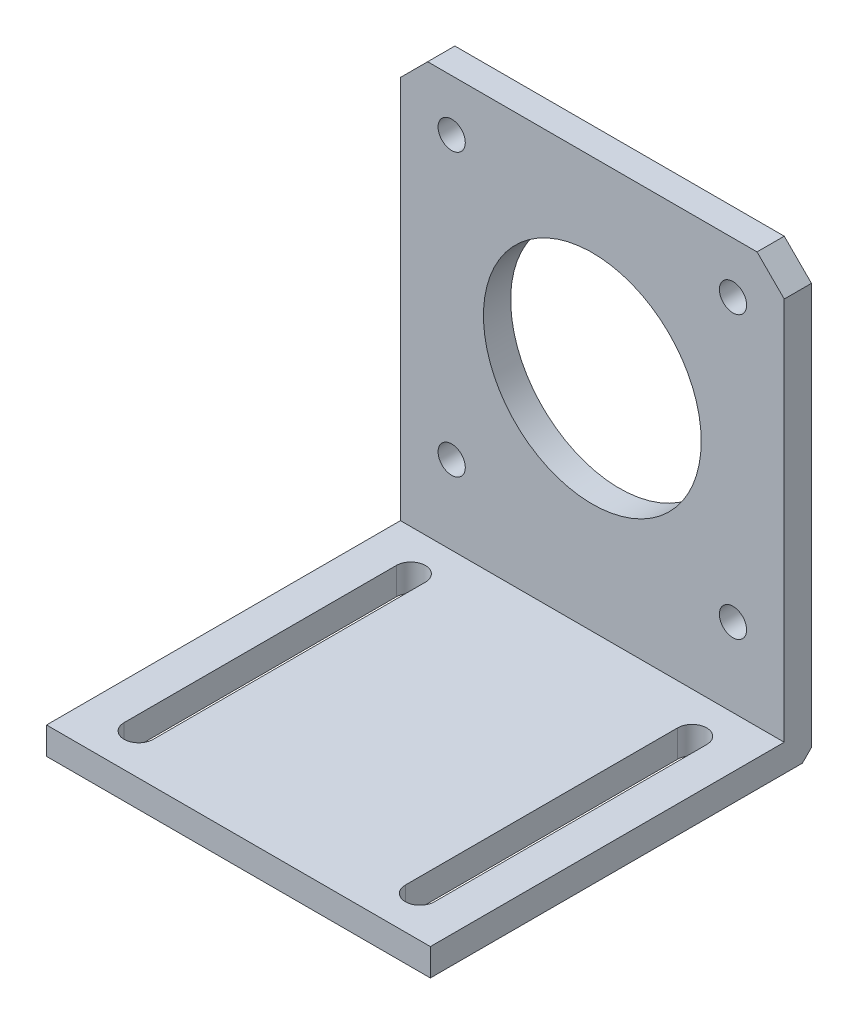
ISO-10303-21;
HEADER;
FILE_DESCRIPTION(('STEP AP214'),'2;1');
FILE_NAME('part.step','',(''),(''),'','','');
FILE_SCHEMA(('AUTOMOTIVE_DESIGN { 1 0 10303 214 1 1 1 1 }'));
ENDSEC;
DATA;
#1=APPLICATION_CONTEXT('core data for automotive mechanical design processes');
#2=APPLICATION_PROTOCOL_DEFINITION('international standard','automotive_design',2000,#1);
#3=PRODUCT_CONTEXT('',#1,'mechanical');
#4=PRODUCT('Part','Part','',(#3));
#5=PRODUCT_RELATED_PRODUCT_CATEGORY('part','',(#4));
#6=PRODUCT_DEFINITION_FORMATION('','',#4);
#7=PRODUCT_DEFINITION_CONTEXT('part definition',#1,'design');
#8=PRODUCT_DEFINITION('design','',#6,#7);
#9=PRODUCT_DEFINITION_SHAPE('','',#8);
#10=(LENGTH_UNIT() NAMED_UNIT(*) SI_UNIT(.MILLI.,.METRE.));
#11=(NAMED_UNIT(*) PLANE_ANGLE_UNIT() SI_UNIT($,.RADIAN.));
#12=(NAMED_UNIT(*) SI_UNIT($,.STERADIAN.) SOLID_ANGLE_UNIT());
#13=UNCERTAINTY_MEASURE_WITH_UNIT(LENGTH_MEASURE(1.E-05),#10,'distance_accuracy_value','');
#14=(GEOMETRIC_REPRESENTATION_CONTEXT(3) GLOBAL_UNCERTAINTY_ASSIGNED_CONTEXT((#13)) GLOBAL_UNIT_ASSIGNED_CONTEXT((#10,
#11,#12)) REPRESENTATION_CONTEXT('',''));
#15=CARTESIAN_POINT('',(0.,0.,0.));
#16=DIRECTION('',(0.,0.,1.));
#17=DIRECTION('',(1.,0.,0.));
#18=AXIS2_PLACEMENT_3D('',#15,#16,#17);
#19=CARTESIAN_POINT('',(0.,0.,3.));
#20=DIRECTION('',(0.,0.,-1.));
#21=DIRECTION('',(-1.,0.,0.));
#22=AXIS2_PLACEMENT_3D('',#19,#20,#21);
#23=PLANE('',#22);
#24=CARTESIAN_POINT('',(-15.4999999999991,-15.5,3.));
#25=DIRECTION('',(0.,0.,1.));
#26=DIRECTION('',(1.,0.,0.));
#27=AXIS2_PLACEMENT_3D('',#24,#25,#26);
#28=CIRCLE('',#27,1.50000000000046);
#29=CARTESIAN_POINT('',(-13.9999999999987,-15.5,3.));
#30=VERTEX_POINT('',#29);
#31=EDGE_CURVE('E247',#30,#30,#28,.T.);
#32=ORIENTED_EDGE('',*,*,#31,.F.);
#33=EDGE_LOOP('',(#32));
#34=FACE_BOUND('',#33,.T.);
#35=CARTESIAN_POINT('',(15.5000000000009,-15.4999999999991,3.));
#36=DIRECTION('',(0.,0.,1.));
#37=DIRECTION('',(1.,0.,0.));
#38=AXIS2_PLACEMENT_3D('',#35,#36,#37);
#39=CIRCLE('',#38,1.50000000000121);
#40=CARTESIAN_POINT('',(17.0000000000021,-15.4999999999991,3.));
#41=VERTEX_POINT('',#40);
#42=EDGE_CURVE('E253',#41,#41,#39,.T.);
#43=ORIENTED_EDGE('',*,*,#42,.F.);
#44=EDGE_LOOP('',(#43));
#45=FACE_BOUND('',#44,.T.);
#46=CARTESIAN_POINT('',(15.5,15.5000000000009,3.));
#47=DIRECTION('',(0.,0.,1.));
#48=DIRECTION('',(1.,0.,0.));
#49=AXIS2_PLACEMENT_3D('',#46,#47,#48);
#50=CIRCLE('',#49,1.50000000000089);
#51=CARTESIAN_POINT('',(17.0000000000009,15.5000000000009,3.));
#52=VERTEX_POINT('',#51);
#53=EDGE_CURVE('E259',#52,#52,#50,.T.);
#54=ORIENTED_EDGE('',*,*,#53,.F.);
#55=EDGE_LOOP('',(#54));
#56=FACE_BOUND('',#55,.T.);
#57=CARTESIAN_POINT('',(0.,0.,3.));
#58=DIRECTION('',(0.,0.,1.));
#59=DIRECTION('',(1.,0.,0.));
#60=AXIS2_PLACEMENT_3D('',#57,#58,#59);
#61=CIRCLE('',#60,12.);
#62=CARTESIAN_POINT('',(12.,0.,3.));
#63=VERTEX_POINT('',#62);
#64=EDGE_CURVE('E265',#63,#63,#61,.T.);
#65=ORIENTED_EDGE('',*,*,#64,.F.);
#66=EDGE_LOOP('',(#65));
#67=FACE_BOUND('',#66,.T.);
#68=CARTESIAN_POINT('',(-15.5,15.5,3.));
#69=DIRECTION('',(0.,0.,1.));
#70=DIRECTION('',(1.,0.,0.));
#71=AXIS2_PLACEMENT_3D('',#68,#69,#70);
#72=CIRCLE('',#71,1.5);
#73=CARTESIAN_POINT('',(-14.,15.5,3.));
#74=VERTEX_POINT('',#73);
#75=EDGE_CURVE('E271',#74,#74,#72,.T.);
#76=ORIENTED_EDGE('',*,*,#75,.F.);
#77=EDGE_LOOP('',(#76));
#78=FACE_BOUND('',#77,.T.);
#79=DIRECTION('',(-1.,0.,0.));
#80=VECTOR('',#79,1.);
#81=CARTESIAN_POINT('',(-21.15,-24.15,3.));
#82=LINE('',#81,#80);
#83=CARTESIAN_POINT('',(21.15,-24.15,3.));
#84=VERTEX_POINT('',#83);
#85=CARTESIAN_POINT('',(-21.15,-24.15,3.));
#86=VERTEX_POINT('',#85);
#87=EDGE_CURVE('E189',#84,#86,#82,.T.);
#88=ORIENTED_EDGE('',*,*,#87,.F.);
#89=DIRECTION('',(0.,1.,0.));
#90=VECTOR('',#89,1.);
#91=CARTESIAN_POINT('',(21.15,18.15,3.));
#92=LINE('',#91,#90);
#93=CARTESIAN_POINT('',(21.15,18.15,3.));
#94=VERTEX_POINT('',#93);
#95=EDGE_CURVE('E285',#84,#94,#92,.T.);
#96=ORIENTED_EDGE('',*,*,#95,.T.);
#97=DIRECTION('',(-0.707106781186548,0.707106781186548,0.));
#98=VECTOR('',#97,1.);
#99=CARTESIAN_POINT('',(18.15,21.15,3.));
#100=LINE('',#99,#98);
#101=CARTESIAN_POINT('',(18.15,21.15,3.));
#102=VERTEX_POINT('',#101);
#103=EDGE_CURVE('E287',#94,#102,#100,.T.);
#104=ORIENTED_EDGE('',*,*,#103,.T.);
#105=DIRECTION('',(-1.,0.,0.));
#106=VECTOR('',#105,1.);
#107=CARTESIAN_POINT('',(-18.15,21.15,3.));
#108=LINE('',#107,#106);
#109=CARTESIAN_POINT('',(-18.15,21.15,3.));
#110=VERTEX_POINT('',#109);
#111=EDGE_CURVE('E277',#102,#110,#108,.T.);
#112=ORIENTED_EDGE('',*,*,#111,.T.);
#113=DIRECTION('',(-0.707106781186548,-0.707106781186548,0.));
#114=VECTOR('',#113,1.);
#115=CARTESIAN_POINT('',(-21.15,18.15,3.));
#116=LINE('',#115,#114);
#117=CARTESIAN_POINT('',(-21.15,18.15,3.));
#118=VERTEX_POINT('',#117);
#119=EDGE_CURVE('E280',#110,#118,#116,.T.);
#120=ORIENTED_EDGE('',*,*,#119,.T.);
#121=DIRECTION('',(0.,-1.,0.));
#122=VECTOR('',#121,1.);
#123=CARTESIAN_POINT('',(-21.15,18.15,3.));
#124=LINE('',#123,#122);
#125=EDGE_CURVE('E283',#118,#86,#124,.T.);
#126=ORIENTED_EDGE('',*,*,#125,.T.);
#127=EDGE_LOOP('',(#88,#96,#104,#112,#120,#126));
#128=FACE_BOUND('',#127,.T.);
#129=ADVANCED_FACE('F33',(#34,#45,#56,#67,#78,#128),#23,.F.);
#130=CARTESIAN_POINT('',(0.,0.,0.));
#131=DIRECTION('',(0.,0.,-1.));
#132=DIRECTION('',(-1.,0.,0.));
#133=AXIS2_PLACEMENT_3D('',#130,#131,#132);
#134=PLANE('',#133);
#135=CARTESIAN_POINT('',(15.5000000000009,-15.4999999999991,0.));
#136=DIRECTION('',(0.,0.,1.));
#137=DIRECTION('',(1.,0.,0.));
#138=AXIS2_PLACEMENT_3D('',#135,#136,#137);
#139=CIRCLE('',#138,1.50000000000121);
#140=CARTESIAN_POINT('',(17.0000000000021,-15.4999999999991,0.));
#141=VERTEX_POINT('',#140);
#142=EDGE_CURVE('E250',#141,#141,#139,.T.);
#143=ORIENTED_EDGE('',*,*,#142,.T.);
#144=EDGE_LOOP('',(#143));
#145=FACE_BOUND('',#144,.T.);
#146=CARTESIAN_POINT('',(0.,0.,0.));
#147=DIRECTION('',(0.,0.,1.));
#148=DIRECTION('',(1.,0.,0.));
#149=AXIS2_PLACEMENT_3D('',#146,#147,#148);
#150=CIRCLE('',#149,12.);
#151=CARTESIAN_POINT('',(12.,0.,0.));
#152=VERTEX_POINT('',#151);
#153=EDGE_CURVE('E262',#152,#152,#150,.T.);
#154=ORIENTED_EDGE('',*,*,#153,.T.);
#155=EDGE_LOOP('',(#154));
#156=FACE_BOUND('',#155,.T.);
#157=DIRECTION('',(0.,1.,0.));
#158=VECTOR('',#157,1.);
#159=CARTESIAN_POINT('',(21.15,18.15,0.));
#160=LINE('',#159,#158);
#161=CARTESIAN_POINT('',(21.15,-26.15,0.));
#162=VERTEX_POINT('',#161);
#163=CARTESIAN_POINT('',(21.15,18.15,0.));
#164=VERTEX_POINT('',#163);
#165=EDGE_CURVE('E297',#162,#164,#160,.T.);
#166=ORIENTED_EDGE('',*,*,#165,.F.);
#167=DIRECTION('',(-1.,0.,0.));
#168=VECTOR('',#167,1.);
#169=CARTESIAN_POINT('',(0.,-26.15,0.));
#170=LINE('',#169,#168);
#171=CARTESIAN_POINT('',(-21.15,-26.15,0.));
#172=VERTEX_POINT('',#171);
#173=EDGE_CURVE('E311',#162,#172,#170,.T.);
#174=ORIENTED_EDGE('',*,*,#173,.T.);
#175=DIRECTION('',(0.,-1.,0.));
#176=VECTOR('',#175,1.);
#177=CARTESIAN_POINT('',(-21.15,18.15,0.));
#178=LINE('',#177,#176);
#179=CARTESIAN_POINT('',(-21.15,18.15,0.));
#180=VERTEX_POINT('',#179);
#181=EDGE_CURVE('E294',#180,#172,#178,.T.);
#182=ORIENTED_EDGE('',*,*,#181,.F.);
#183=DIRECTION('',(-0.707106781186548,-0.707106781186548,0.));
#184=VECTOR('',#183,1.);
#185=CARTESIAN_POINT('',(-21.15,18.15,0.));
#186=LINE('',#185,#184);
#187=CARTESIAN_POINT('',(-18.15,21.15,0.));
#188=VERTEX_POINT('',#187);
#189=EDGE_CURVE('E292',#188,#180,#186,.T.);
#190=ORIENTED_EDGE('',*,*,#189,.F.);
#191=DIRECTION('',(-1.,0.,0.));
#192=VECTOR('',#191,1.);
#193=CARTESIAN_POINT('',(-18.15,21.15,0.));
#194=LINE('',#193,#192);
#195=CARTESIAN_POINT('',(18.15,21.15,0.));
#196=VERTEX_POINT('',#195);
#197=EDGE_CURVE('E274',#196,#188,#194,.T.);
#198=ORIENTED_EDGE('',*,*,#197,.F.);
#199=DIRECTION('',(-0.707106781186548,0.707106781186548,0.));
#200=VECTOR('',#199,1.);
#201=CARTESIAN_POINT('',(18.15,21.15,0.));
#202=LINE('',#201,#200);
#203=EDGE_CURVE('E281',#164,#196,#202,.T.);
#204=ORIENTED_EDGE('',*,*,#203,.F.);
#205=EDGE_LOOP('',(#166,#174,#182,#190,#198,#204));
#206=FACE_BOUND('',#205,.T.);
#207=CARTESIAN_POINT('',(-15.5,15.5,0.));
#208=DIRECTION('',(0.,0.,1.));
#209=DIRECTION('',(1.,0.,0.));
#210=AXIS2_PLACEMENT_3D('',#207,#208,#209);
#211=CIRCLE('',#210,1.5);
#212=CARTESIAN_POINT('',(-14.,15.5,0.));
#213=VERTEX_POINT('',#212);
#214=EDGE_CURVE('E268',#213,#213,#211,.T.);
#215=ORIENTED_EDGE('',*,*,#214,.T.);
#216=EDGE_LOOP('',(#215));
#217=FACE_BOUND('',#216,.T.);
#218=CARTESIAN_POINT('',(15.5,15.5000000000009,0.));
#219=DIRECTION('',(0.,0.,1.));
#220=DIRECTION('',(1.,0.,0.));
#221=AXIS2_PLACEMENT_3D('',#218,#219,#220);
#222=CIRCLE('',#221,1.50000000000089);
#223=CARTESIAN_POINT('',(17.0000000000009,15.5000000000009,0.));
#224=VERTEX_POINT('',#223);
#225=EDGE_CURVE('E256',#224,#224,#222,.T.);
#226=ORIENTED_EDGE('',*,*,#225,.T.);
#227=EDGE_LOOP('',(#226));
#228=FACE_BOUND('',#227,.T.);
#229=CARTESIAN_POINT('',(-15.4999999999991,-15.5,0.));
#230=DIRECTION('',(0.,0.,1.));
#231=DIRECTION('',(1.,0.,0.));
#232=AXIS2_PLACEMENT_3D('',#229,#230,#231);
#233=CIRCLE('',#232,1.50000000000046);
#234=CARTESIAN_POINT('',(-13.9999999999987,-15.5,0.));
#235=VERTEX_POINT('',#234);
#236=EDGE_CURVE('E244',#235,#235,#233,.T.);
#237=ORIENTED_EDGE('',*,*,#236,.T.);
#238=EDGE_LOOP('',(#237));
#239=FACE_BOUND('',#238,.T.);
#240=ADVANCED_FACE('F328',(#145,#156,#206,#217,#228,#239),#134,.T.);
#241=CARTESIAN_POINT('',(-18.15,21.15,3.));
#242=DIRECTION('',(0.,-1.,0.));
#243=DIRECTION('',(0.,0.,-1.));
#244=AXIS2_PLACEMENT_3D('',#241,#242,#243);
#245=PLANE('',#244);
#246=ORIENTED_EDGE('',*,*,#197,.T.);
#247=DIRECTION('',(0.,0.,-1.));
#248=VECTOR('',#247,1.);
#249=CARTESIAN_POINT('',(-18.15,21.15,3.));
#250=LINE('',#249,#248);
#251=EDGE_CURVE('E308',#110,#188,#250,.T.);
#252=ORIENTED_EDGE('',*,*,#251,.F.);
#253=ORIENTED_EDGE('',*,*,#111,.F.);
#254=DIRECTION('',(0.,0.,-1.));
#255=VECTOR('',#254,1.);
#256=CARTESIAN_POINT('',(18.15,21.15,3.));
#257=LINE('',#256,#255);
#258=EDGE_CURVE('E289',#102,#196,#257,.T.);
#259=ORIENTED_EDGE('',*,*,#258,.T.);
#260=EDGE_LOOP('',(#246,#252,#253,#259));
#261=FACE_BOUND('',#260,.T.);
#262=ADVANCED_FACE('F340',(#261),#245,.F.);
#263=CARTESIAN_POINT('',(-21.15,18.15,3.));
#264=DIRECTION('',(0.707106781186547,-0.707106781186547,0.));
#265=DIRECTION('',(0.707106781186548,0.707106781186548,0.));
#266=AXIS2_PLACEMENT_3D('',#263,#264,#265);
#267=PLANE('',#266);
#268=ORIENTED_EDGE('',*,*,#189,.T.);
#269=DIRECTION('',(0.,0.,-1.));
#270=VECTOR('',#269,1.);
#271=CARTESIAN_POINT('',(-21.15,18.15,3.));
#272=LINE('',#271,#270);
#273=EDGE_CURVE('E305',#118,#180,#272,.T.);
#274=ORIENTED_EDGE('',*,*,#273,.F.);
#275=ORIENTED_EDGE('',*,*,#119,.F.);
#276=ORIENTED_EDGE('',*,*,#251,.T.);
#277=EDGE_LOOP('',(#268,#274,#275,#276));
#278=FACE_BOUND('',#277,.T.);
#279=ADVANCED_FACE('F336',(#278),#267,.F.);
#280=CARTESIAN_POINT('',(-21.15,18.15,3.));
#281=DIRECTION('',(1.,0.,0.));
#282=DIRECTION('',(0.,1.,0.));
#283=AXIS2_PLACEMENT_3D('',#280,#281,#282);
#284=PLANE('',#283);
#285=ORIENTED_EDGE('',*,*,#181,.T.);
#286=DIRECTION('',(0.,0.707106781186545,-0.70710678118655));
#287=VECTOR('',#286,1.);
#288=CARTESIAN_POINT('',(-21.15,-26.15,0.));
#289=LINE('',#288,#287);
#290=CARTESIAN_POINT('',(-21.15,-27.15,1.));
#291=VERTEX_POINT('',#290);
#292=EDGE_CURVE('E314',#172,#291,#289,.F.);
#293=ORIENTED_EDGE('',*,*,#292,.T.);
#294=DIRECTION('',(0.,0.,-1.));
#295=VECTOR('',#294,1.);
#296=CARTESIAN_POINT('',(-21.15,-27.15,3.));
#297=LINE('',#296,#295);
#298=CARTESIAN_POINT('',(-21.15,-27.15,42.));
#299=VERTEX_POINT('',#298);
#300=EDGE_CURVE('E241',#299,#291,#297,.T.);
#301=ORIENTED_EDGE('',*,*,#300,.F.);
#302=DIRECTION('',(0.,-1.,0.));
#303=VECTOR('',#302,1.);
#304=CARTESIAN_POINT('',(-21.15,-27.15,42.));
#305=LINE('',#304,#303);
#306=CARTESIAN_POINT('',(-21.15,-24.15,42.));
#307=VERTEX_POINT('',#306);
#308=EDGE_CURVE('E222',#307,#299,#305,.T.);
#309=ORIENTED_EDGE('',*,*,#308,.F.);
#310=DIRECTION('',(0.,0.,-1.));
#311=VECTOR('',#310,1.);
#312=CARTESIAN_POINT('',(-21.15,-24.15,42.));
#313=LINE('',#312,#311);
#314=EDGE_CURVE('E232',#307,#86,#313,.T.);
#315=ORIENTED_EDGE('',*,*,#314,.T.);
#316=ORIENTED_EDGE('',*,*,#125,.F.);
#317=ORIENTED_EDGE('',*,*,#273,.T.);
#318=EDGE_LOOP('',(#285,#293,#301,#309,#315,#316,#317));
#319=FACE_BOUND('',#318,.T.);
#320=ADVANCED_FACE('F332',(#319),#284,.F.);
#321=CARTESIAN_POINT('',(21.15,18.15,3.));
#322=DIRECTION('',(-1.,0.,0.));
#323=DIRECTION('',(0.,-1.,0.));
#324=AXIS2_PLACEMENT_3D('',#321,#322,#323);
#325=PLANE('',#324);
#326=DIRECTION('',(0.,0.,-1.));
#327=VECTOR('',#326,1.);
#328=CARTESIAN_POINT('',(21.15,-27.15,3.));
#329=LINE('',#328,#327);
#330=CARTESIAN_POINT('',(21.15,-27.15,42.));
#331=VERTEX_POINT('',#330);
#332=CARTESIAN_POINT('',(21.15,-27.15,1.));
#333=VERTEX_POINT('',#332);
#334=EDGE_CURVE('E240',#331,#333,#329,.T.);
#335=ORIENTED_EDGE('',*,*,#334,.T.);
#336=DIRECTION('',(0.,-0.707106781186545,0.70710678118655));
#337=VECTOR('',#336,1.);
#338=CARTESIAN_POINT('',(21.15,-26.15,0.));
#339=LINE('',#338,#337);
#340=EDGE_CURVE('E11',#333,#162,#339,.F.);
#341=ORIENTED_EDGE('',*,*,#340,.T.);
#342=ORIENTED_EDGE('',*,*,#165,.T.);
#343=DIRECTION('',(0.,0.,-1.));
#344=VECTOR('',#343,1.);
#345=CARTESIAN_POINT('',(21.15,18.15,3.));
#346=LINE('',#345,#344);
#347=EDGE_CURVE('E302',#94,#164,#346,.T.);
#348=ORIENTED_EDGE('',*,*,#347,.F.);
#349=ORIENTED_EDGE('',*,*,#95,.F.);
#350=DIRECTION('',(0.,0.,-1.));
#351=VECTOR('',#350,1.);
#352=CARTESIAN_POINT('',(21.15,-24.15,42.));
#353=LINE('',#352,#351);
#354=CARTESIAN_POINT('',(21.15,-24.15,42.));
#355=VERTEX_POINT('',#354);
#356=EDGE_CURVE('E237',#355,#84,#353,.T.);
#357=ORIENTED_EDGE('',*,*,#356,.F.);
#358=DIRECTION('',(0.,1.,0.));
#359=VECTOR('',#358,1.);
#360=CARTESIAN_POINT('',(21.15,-27.15,42.));
#361=LINE('',#360,#359);
#362=EDGE_CURVE('E228',#331,#355,#361,.T.);
#363=ORIENTED_EDGE('',*,*,#362,.F.);
#364=EDGE_LOOP('',(#335,#341,#342,#348,#349,#357,#363));
#365=FACE_BOUND('',#364,.T.);
#366=ADVANCED_FACE('F322',(#365),#325,.F.);
#367=CARTESIAN_POINT('',(18.15,21.15,3.));
#368=DIRECTION('',(-0.707106781186547,-0.707106781186547,0.));
#369=DIRECTION('',(0.707106781186548,-0.707106781186548,0.));
#370=AXIS2_PLACEMENT_3D('',#367,#368,#369);
#371=PLANE('',#370);
#372=ORIENTED_EDGE('',*,*,#203,.T.);
#373=ORIENTED_EDGE('',*,*,#258,.F.);
#374=ORIENTED_EDGE('',*,*,#103,.F.);
#375=ORIENTED_EDGE('',*,*,#347,.T.);
#376=EDGE_LOOP('',(#372,#373,#374,#375));
#377=FACE_BOUND('',#376,.T.);
#378=ADVANCED_FACE('F345',(#377),#371,.F.);
#379=CARTESIAN_POINT('',(-15.5,15.5,3.));
#380=DIRECTION('',(0.,0.,-1.));
#381=DIRECTION('',(-1.,0.,0.));
#382=AXIS2_PLACEMENT_3D('',#379,#380,#381);
#383=CYLINDRICAL_SURFACE('',#382,1.5);
#384=ORIENTED_EDGE('',*,*,#75,.T.);
#385=EDGE_LOOP('',(#384));
#386=FACE_BOUND('',#385,.T.);
#387=ORIENTED_EDGE('',*,*,#214,.F.);
#388=EDGE_LOOP('',(#387));
#389=FACE_BOUND('',#388,.T.);
#390=ADVANCED_FACE('F377',(#386,#389),#383,.F.);
#391=CARTESIAN_POINT('',(0.,0.,3.));
#392=DIRECTION('',(0.,0.,-1.));
#393=DIRECTION('',(-1.,0.,0.));
#394=AXIS2_PLACEMENT_3D('',#391,#392,#393);
#395=CYLINDRICAL_SURFACE('',#394,12.);
#396=ORIENTED_EDGE('',*,*,#64,.T.);
#397=EDGE_LOOP('',(#396));
#398=FACE_BOUND('',#397,.T.);
#399=ORIENTED_EDGE('',*,*,#153,.F.);
#400=EDGE_LOOP('',(#399));
#401=FACE_BOUND('',#400,.T.);
#402=ADVANCED_FACE('F415',(#398,#401),#395,.F.);
#403=CARTESIAN_POINT('',(15.5,15.5000000000009,3.));
#404=DIRECTION('',(0.,0.,-1.));
#405=DIRECTION('',(-1.,0.,0.));
#406=AXIS2_PLACEMENT_3D('',#403,#404,#405);
#407=CYLINDRICAL_SURFACE('',#406,1.50000000000089);
#408=ORIENTED_EDGE('',*,*,#53,.T.);
#409=EDGE_LOOP('',(#408));
#410=FACE_BOUND('',#409,.T.);
#411=ORIENTED_EDGE('',*,*,#225,.F.);
#412=EDGE_LOOP('',(#411));
#413=FACE_BOUND('',#412,.T.);
#414=ADVANCED_FACE('F422',(#410,#413),#407,.F.);
#415=CARTESIAN_POINT('',(15.5000000000009,-15.4999999999991,3.));
#416=DIRECTION('',(0.,0.,-1.));
#417=DIRECTION('',(-1.,0.,0.));
#418=AXIS2_PLACEMENT_3D('',#415,#416,#417);
#419=CYLINDRICAL_SURFACE('',#418,1.50000000000121);
#420=ORIENTED_EDGE('',*,*,#42,.T.);
#421=EDGE_LOOP('',(#420));
#422=FACE_BOUND('',#421,.T.);
#423=ORIENTED_EDGE('',*,*,#142,.F.);
#424=EDGE_LOOP('',(#423));
#425=FACE_BOUND('',#424,.T.);
#426=ADVANCED_FACE('F429',(#422,#425),#419,.F.);
#427=CARTESIAN_POINT('',(-15.4999999999991,-15.5,3.));
#428=DIRECTION('',(0.,0.,-1.));
#429=DIRECTION('',(-1.,0.,0.));
#430=AXIS2_PLACEMENT_3D('',#427,#428,#429);
#431=CYLINDRICAL_SURFACE('',#430,1.50000000000046);
#432=ORIENTED_EDGE('',*,*,#31,.T.);
#433=EDGE_LOOP('',(#432));
#434=FACE_BOUND('',#433,.T.);
#435=ORIENTED_EDGE('',*,*,#236,.F.);
#436=EDGE_LOOP('',(#435));
#437=FACE_BOUND('',#436,.T.);
#438=ADVANCED_FACE('F437',(#434,#437),#431,.F.);
#439=CARTESIAN_POINT('',(21.15,-27.15,3.));
#440=DIRECTION('',(0.,-1.,0.));
#441=DIRECTION('',(0.,0.,-1.));
#442=AXIS2_PLACEMENT_3D('',#439,#440,#441);
#443=PLANE('',#442);
#444=CARTESIAN_POINT('',(15.5,-27.15,7.5));
#445=DIRECTION('',(0.,1.,0.));
#446=DIRECTION('',(0.,0.,1.));
#447=AXIS2_PLACEMENT_3D('',#444,#445,#446);
#448=CIRCLE('',#447,1.6);
#449=CARTESIAN_POINT('',(17.1,-27.15,7.5));
#450=VERTEX_POINT('',#449);
#451=CARTESIAN_POINT('',(13.9,-27.15,7.5));
#452=VERTEX_POINT('',#451);
#453=EDGE_CURVE('E155',#450,#452,#448,.T.);
#454=ORIENTED_EDGE('',*,*,#453,.T.);
#455=DIRECTION('',(0.,0.,1.));
#456=VECTOR('',#455,1.);
#457=CARTESIAN_POINT('',(13.9,-27.15,7.5));
#458=LINE('',#457,#456);
#459=CARTESIAN_POINT('',(13.9,-27.15,37.5));
#460=VERTEX_POINT('',#459);
#461=EDGE_CURVE('E166',#452,#460,#458,.T.);
#462=ORIENTED_EDGE('',*,*,#461,.T.);
#463=CARTESIAN_POINT('',(15.5,-27.15,37.5));
#464=DIRECTION('',(0.,1.,0.));
#465=DIRECTION('',(0.,0.,1.));
#466=AXIS2_PLACEMENT_3D('',#463,#464,#465);
#467=CIRCLE('',#466,1.6);
#468=CARTESIAN_POINT('',(17.1,-27.15,37.5));
#469=VERTEX_POINT('',#468);
#470=EDGE_CURVE('E48',#460,#469,#467,.T.);
#471=ORIENTED_EDGE('',*,*,#470,.T.);
#472=DIRECTION('',(0.,0.,-1.));
#473=VECTOR('',#472,1.);
#474=CARTESIAN_POINT('',(17.1,-27.15,7.5));
#475=LINE('',#474,#473);
#476=EDGE_CURVE('E163',#469,#450,#475,.T.);
#477=ORIENTED_EDGE('',*,*,#476,.T.);
#478=EDGE_LOOP('',(#454,#462,#471,#477));
#479=FACE_BOUND('',#478,.T.);
#480=CARTESIAN_POINT('',(-15.5,-27.15,7.5));
#481=DIRECTION('',(0.,1.,0.));
#482=DIRECTION('',(0.,0.,-1.));
#483=AXIS2_PLACEMENT_3D('',#480,#481,#482);
#484=CIRCLE('',#483,1.6);
#485=CARTESIAN_POINT('',(-13.9,-27.15,7.5));
#486=VERTEX_POINT('',#485);
#487=CARTESIAN_POINT('',(-17.1,-27.15,7.5));
#488=VERTEX_POINT('',#487);
#489=EDGE_CURVE('E193',#486,#488,#484,.T.);
#490=ORIENTED_EDGE('',*,*,#489,.T.);
#491=DIRECTION('',(0.,0.,1.));
#492=VECTOR('',#491,1.);
#493=CARTESIAN_POINT('',(-17.1,-27.15,7.5));
#494=LINE('',#493,#492);
#495=CARTESIAN_POINT('',(-17.1,-27.15,37.5));
#496=VERTEX_POINT('',#495);
#497=EDGE_CURVE('E196',#488,#496,#494,.T.);
#498=ORIENTED_EDGE('',*,*,#497,.T.);
#499=CARTESIAN_POINT('',(-15.5,-27.15,37.5));
#500=DIRECTION('',(0.,1.,0.));
#501=DIRECTION('',(0.,0.,-1.));
#502=AXIS2_PLACEMENT_3D('',#499,#500,#501);
#503=CIRCLE('',#502,1.6);
#504=CARTESIAN_POINT('',(-13.9,-27.15,37.5));
#505=VERTEX_POINT('',#504);
#506=EDGE_CURVE('E56',#496,#505,#503,.T.);
#507=ORIENTED_EDGE('',*,*,#506,.T.);
#508=DIRECTION('',(0.,0.,-1.));
#509=VECTOR('',#508,1.);
#510=CARTESIAN_POINT('',(-13.9,-27.15,7.5));
#511=LINE('',#510,#509);
#512=EDGE_CURVE('E201',#505,#486,#511,.T.);
#513=ORIENTED_EDGE('',*,*,#512,.T.);
#514=EDGE_LOOP('',(#490,#498,#507,#513));
#515=FACE_BOUND('',#514,.T.);
#516=ORIENTED_EDGE('',*,*,#300,.T.);
#517=DIRECTION('',(1.,0.,0.));
#518=VECTOR('',#517,1.);
#519=CARTESIAN_POINT('',(21.15,-27.15,1.));
#520=LINE('',#519,#518);
#521=EDGE_CURVE('E41',#291,#333,#520,.T.);
#522=ORIENTED_EDGE('',*,*,#521,.T.);
#523=ORIENTED_EDGE('',*,*,#334,.F.);
#524=DIRECTION('',(1.,0.,0.));
#525=VECTOR('',#524,1.);
#526=CARTESIAN_POINT('',(-21.15,-27.15,42.));
#527=LINE('',#526,#525);
#528=EDGE_CURVE('E225',#299,#331,#527,.T.);
#529=ORIENTED_EDGE('',*,*,#528,.F.);
#530=EDGE_LOOP('',(#516,#522,#523,#529));
#531=FACE_BOUND('',#530,.T.);
#532=ADVANCED_FACE('F170',(#479,#515,#531),#443,.T.);
#533=CARTESIAN_POINT('',(-21.15,-24.15,42.));
#534=DIRECTION('',(0.,-1.,0.));
#535=DIRECTION('',(0.,0.,-1.));
#536=AXIS2_PLACEMENT_3D('',#533,#534,#535);
#537=PLANE('',#536);
#538=DIRECTION('',(0.,0.,1.));
#539=VECTOR('',#538,1.);
#540=CARTESIAN_POINT('',(13.9,-24.15,7.5));
#541=LINE('',#540,#539);
#542=CARTESIAN_POINT('',(13.9,-24.15,7.5));
#543=VERTEX_POINT('',#542);
#544=CARTESIAN_POINT('',(13.9,-24.15,37.5));
#545=VERTEX_POINT('',#544);
#546=EDGE_CURVE('E182',#543,#545,#541,.T.);
#547=ORIENTED_EDGE('',*,*,#546,.F.);
#548=CARTESIAN_POINT('',(15.5,-24.15,7.5));
#549=DIRECTION('',(0.,1.,0.));
#550=DIRECTION('',(0.,0.,1.));
#551=AXIS2_PLACEMENT_3D('',#548,#549,#550);
#552=CIRCLE('',#551,1.6);
#553=CARTESIAN_POINT('',(17.1,-24.15,7.5));
#554=VERTEX_POINT('',#553);
#555=EDGE_CURVE('E158',#554,#543,#552,.T.);
#556=ORIENTED_EDGE('',*,*,#555,.F.);
#557=DIRECTION('',(0.,0.,-1.));
#558=VECTOR('',#557,1.);
#559=CARTESIAN_POINT('',(17.1,-24.15,7.5));
#560=LINE('',#559,#558);
#561=CARTESIAN_POINT('',(17.1,-24.15,37.5));
#562=VERTEX_POINT('',#561);
#563=EDGE_CURVE('E173',#562,#554,#560,.T.);
#564=ORIENTED_EDGE('',*,*,#563,.F.);
#565=CARTESIAN_POINT('',(15.5,-24.15,37.5));
#566=DIRECTION('',(0.,1.,0.));
#567=DIRECTION('',(0.,0.,1.));
#568=AXIS2_PLACEMENT_3D('',#565,#566,#567);
#569=CIRCLE('',#568,1.6);
#570=EDGE_CURVE('E176',#545,#562,#569,.T.);
#571=ORIENTED_EDGE('',*,*,#570,.F.);
#572=EDGE_LOOP('',(#547,#556,#564,#571));
#573=FACE_BOUND('',#572,.T.);
#574=DIRECTION('',(0.,0.,1.));
#575=VECTOR('',#574,1.);
#576=CARTESIAN_POINT('',(-17.1,-24.15,7.5));
#577=LINE('',#576,#575);
#578=CARTESIAN_POINT('',(-17.1,-24.15,7.50000000000001));
#579=VERTEX_POINT('',#578);
#580=CARTESIAN_POINT('',(-17.1,-24.15,37.5));
#581=VERTEX_POINT('',#580);
#582=EDGE_CURVE('E207',#579,#581,#577,.T.);
#583=ORIENTED_EDGE('',*,*,#582,.F.);
#584=CARTESIAN_POINT('',(-15.5,-24.15,7.5));
#585=DIRECTION('',(0.,1.,0.));
#586=DIRECTION('',(0.,0.,-1.));
#587=AXIS2_PLACEMENT_3D('',#584,#585,#586);
#588=CIRCLE('',#587,1.6);
#589=CARTESIAN_POINT('',(-13.9,-24.15,7.5));
#590=VERTEX_POINT('',#589);
#591=EDGE_CURVE('E205',#590,#579,#588,.T.);
#592=ORIENTED_EDGE('',*,*,#591,.F.);
#593=DIRECTION('',(0.,0.,-1.));
#594=VECTOR('',#593,1.);
#595=CARTESIAN_POINT('',(-13.9,-24.15,7.5));
#596=LINE('',#595,#594);
#597=CARTESIAN_POINT('',(-13.9,-24.15,37.5));
#598=VERTEX_POINT('',#597);
#599=EDGE_CURVE('E197',#598,#590,#596,.T.);
#600=ORIENTED_EDGE('',*,*,#599,.F.);
#601=CARTESIAN_POINT('',(-15.5,-24.15,37.5));
#602=DIRECTION('',(0.,1.,0.));
#603=DIRECTION('',(0.,0.,-1.));
#604=AXIS2_PLACEMENT_3D('',#601,#602,#603);
#605=CIRCLE('',#604,1.6);
#606=EDGE_CURVE('E210',#581,#598,#605,.T.);
#607=ORIENTED_EDGE('',*,*,#606,.F.);
#608=EDGE_LOOP('',(#583,#592,#600,#607));
#609=FACE_BOUND('',#608,.T.);
#610=ORIENTED_EDGE('',*,*,#87,.T.);
#611=ORIENTED_EDGE('',*,*,#314,.F.);
#612=DIRECTION('',(-1.,0.,0.));
#613=VECTOR('',#612,1.);
#614=CARTESIAN_POINT('',(-21.15,-24.15,42.));
#615=LINE('',#614,#613);
#616=EDGE_CURVE('E230',#355,#307,#615,.T.);
#617=ORIENTED_EDGE('',*,*,#616,.F.);
#618=ORIENTED_EDGE('',*,*,#356,.T.);
#619=EDGE_LOOP('',(#610,#611,#617,#618));
#620=FACE_BOUND('',#619,.T.);
#621=ADVANCED_FACE('F351',(#573,#609,#620),#537,.F.);
#622=CARTESIAN_POINT('',(0.,0.,42.));
#623=DIRECTION('',(0.,0.,-1.));
#624=DIRECTION('',(-1.,0.,0.));
#625=AXIS2_PLACEMENT_3D('',#622,#623,#624);
#626=PLANE('',#625);
#627=ORIENTED_EDGE('',*,*,#308,.T.);
#628=ORIENTED_EDGE('',*,*,#528,.T.);
#629=ORIENTED_EDGE('',*,*,#362,.T.);
#630=ORIENTED_EDGE('',*,*,#616,.T.);
#631=EDGE_LOOP('',(#627,#628,#629,#630));
#632=FACE_BOUND('',#631,.T.);
#633=ADVANCED_FACE('F355',(#632),#626,.F.);
#634=CARTESIAN_POINT('',(0.,-26.15,0.));
#635=DIRECTION('',(0.,0.70710678118655,0.707106781186545));
#636=DIRECTION('',(-1.,0.,0.));
#637=AXIS2_PLACEMENT_3D('',#634,#635,#636);
#638=PLANE('',#637);
#639=ORIENTED_EDGE('',*,*,#340,.F.);
#640=ORIENTED_EDGE('',*,*,#521,.F.);
#641=ORIENTED_EDGE('',*,*,#292,.F.);
#642=ORIENTED_EDGE('',*,*,#173,.F.);
#643=EDGE_LOOP('',(#639,#640,#641,#642));
#644=FACE_BOUND('',#643,.T.);
#645=ADVANCED_FACE('F35',(#644),#638,.F.);
#646=CARTESIAN_POINT('',(-15.5,-27.15,7.5));
#647=DIRECTION('',(0.,1.,0.));
#648=DIRECTION('',(0.,0.,1.));
#649=AXIS2_PLACEMENT_3D('',#646,#647,#648);
#650=CYLINDRICAL_SURFACE('',#649,1.6);
#651=ORIENTED_EDGE('',*,*,#591,.T.);
#652=DIRECTION('',(0.,1.,0.));
#653=VECTOR('',#652,1.);
#654=CARTESIAN_POINT('',(-17.1,-27.15,7.5));
#655=LINE('',#654,#653);
#656=EDGE_CURVE('E204',#488,#579,#655,.T.);
#657=ORIENTED_EDGE('',*,*,#656,.F.);
#658=ORIENTED_EDGE('',*,*,#489,.F.);
#659=DIRECTION('',(0.,1.,0.));
#660=VECTOR('',#659,1.);
#661=CARTESIAN_POINT('',(-13.9,-27.15,7.5));
#662=LINE('',#661,#660);
#663=EDGE_CURVE('E183',#486,#590,#662,.T.);
#664=ORIENTED_EDGE('',*,*,#663,.T.);
#665=EDGE_LOOP('',(#651,#657,#658,#664));
#666=FACE_BOUND('',#665,.T.);
#667=ADVANCED_FACE('F362',(#666),#650,.F.);
#668=CARTESIAN_POINT('',(-13.9,-27.15,7.5));
#669=DIRECTION('',(1.,0.,0.));
#670=DIRECTION('',(0.,0.,-1.));
#671=AXIS2_PLACEMENT_3D('',#668,#669,#670);
#672=PLANE('',#671);
#673=ORIENTED_EDGE('',*,*,#599,.T.);
#674=ORIENTED_EDGE('',*,*,#663,.F.);
#675=ORIENTED_EDGE('',*,*,#512,.F.);
#676=DIRECTION('',(0.,1.,0.));
#677=VECTOR('',#676,1.);
#678=CARTESIAN_POINT('',(-13.9,-27.15,37.5));
#679=LINE('',#678,#677);
#680=EDGE_CURVE('E216',#505,#598,#679,.T.);
#681=ORIENTED_EDGE('',*,*,#680,.T.);
#682=EDGE_LOOP('',(#673,#674,#675,#681));
#683=FACE_BOUND('',#682,.T.);
#684=ADVANCED_FACE('F466',(#683),#672,.F.);
#685=CARTESIAN_POINT('',(-15.5,-27.15,37.5));
#686=DIRECTION('',(0.,1.,0.));
#687=DIRECTION('',(0.,0.,1.));
#688=AXIS2_PLACEMENT_3D('',#685,#686,#687);
#689=CYLINDRICAL_SURFACE('',#688,1.6);
#690=ORIENTED_EDGE('',*,*,#606,.T.);
#691=ORIENTED_EDGE('',*,*,#680,.F.);
#692=ORIENTED_EDGE('',*,*,#506,.F.);
#693=DIRECTION('',(0.,1.,0.));
#694=VECTOR('',#693,1.);
#695=CARTESIAN_POINT('',(-17.1,-27.15,37.5));
#696=LINE('',#695,#694);
#697=EDGE_CURVE('E218',#496,#581,#696,.T.);
#698=ORIENTED_EDGE('',*,*,#697,.T.);
#699=EDGE_LOOP('',(#690,#691,#692,#698));
#700=FACE_BOUND('',#699,.T.);
#701=ADVANCED_FACE('F476',(#700),#689,.F.);
#702=CARTESIAN_POINT('',(-17.1,-27.15,7.5));
#703=DIRECTION('',(-1.,0.,0.));
#704=DIRECTION('',(0.,0.,1.));
#705=AXIS2_PLACEMENT_3D('',#702,#703,#704);
#706=PLANE('',#705);
#707=ORIENTED_EDGE('',*,*,#582,.T.);
#708=ORIENTED_EDGE('',*,*,#697,.F.);
#709=ORIENTED_EDGE('',*,*,#497,.F.);
#710=ORIENTED_EDGE('',*,*,#656,.T.);
#711=EDGE_LOOP('',(#707,#708,#709,#710));
#712=FACE_BOUND('',#711,.T.);
#713=ADVANCED_FACE('F486',(#712),#706,.F.);
#714=CARTESIAN_POINT('',(15.5,-27.15,7.5));
#715=DIRECTION('',(0.,1.,0.));
#716=DIRECTION('',(0.,0.,1.));
#717=AXIS2_PLACEMENT_3D('',#714,#715,#716);
#718=CYLINDRICAL_SURFACE('',#717,1.6);
#719=ORIENTED_EDGE('',*,*,#555,.T.);
#720=DIRECTION('',(0.,1.,0.));
#721=VECTOR('',#720,1.);
#722=CARTESIAN_POINT('',(13.9,-27.15,7.5));
#723=LINE('',#722,#721);
#724=EDGE_CURVE('E151',#452,#543,#723,.T.);
#725=ORIENTED_EDGE('',*,*,#724,.F.);
#726=ORIENTED_EDGE('',*,*,#453,.F.);
#727=DIRECTION('',(0.,1.,0.));
#728=VECTOR('',#727,1.);
#729=CARTESIAN_POINT('',(17.1,-27.15,7.5));
#730=LINE('',#729,#728);
#731=EDGE_CURVE('E187',#450,#554,#730,.T.);
#732=ORIENTED_EDGE('',*,*,#731,.T.);
#733=EDGE_LOOP('',(#719,#725,#726,#732));
#734=FACE_BOUND('',#733,.T.);
#735=ADVANCED_FACE('F153',(#734),#718,.F.);
#736=CARTESIAN_POINT('',(17.1,-27.15,7.5));
#737=DIRECTION('',(1.,0.,0.));
#738=DIRECTION('',(0.,0.,-1.));
#739=AXIS2_PLACEMENT_3D('',#736,#737,#738);
#740=PLANE('',#739);
#741=ORIENTED_EDGE('',*,*,#563,.T.);
#742=ORIENTED_EDGE('',*,*,#731,.F.);
#743=ORIENTED_EDGE('',*,*,#476,.F.);
#744=DIRECTION('',(0.,1.,0.));
#745=VECTOR('',#744,1.);
#746=CARTESIAN_POINT('',(17.1,-27.15,37.5));
#747=LINE('',#746,#745);
#748=EDGE_CURVE('E190',#469,#562,#747,.T.);
#749=ORIENTED_EDGE('',*,*,#748,.T.);
#750=EDGE_LOOP('',(#741,#742,#743,#749));
#751=FACE_BOUND('',#750,.T.);
#752=ADVANCED_FACE('F504',(#751),#740,.F.);
#753=CARTESIAN_POINT('',(15.5,-27.15,37.5));
#754=DIRECTION('',(0.,1.,0.));
#755=DIRECTION('',(0.,0.,1.));
#756=AXIS2_PLACEMENT_3D('',#753,#754,#755);
#757=CYLINDRICAL_SURFACE('',#756,1.6);
#758=ORIENTED_EDGE('',*,*,#570,.T.);
#759=ORIENTED_EDGE('',*,*,#748,.F.);
#760=ORIENTED_EDGE('',*,*,#470,.F.);
#761=DIRECTION('',(0.,1.,0.));
#762=VECTOR('',#761,1.);
#763=CARTESIAN_POINT('',(13.9,-27.15,37.5));
#764=LINE('',#763,#762);
#765=EDGE_CURVE('E162',#460,#545,#764,.T.);
#766=ORIENTED_EDGE('',*,*,#765,.T.);
#767=EDGE_LOOP('',(#758,#759,#760,#766));
#768=FACE_BOUND('',#767,.T.);
#769=ADVANCED_FACE('F513',(#768),#757,.F.);
#770=CARTESIAN_POINT('',(13.9,-27.15,7.5));
#771=DIRECTION('',(-1.,0.,0.));
#772=DIRECTION('',(0.,0.,1.));
#773=AXIS2_PLACEMENT_3D('',#770,#771,#772);
#774=PLANE('',#773);
#775=ORIENTED_EDGE('',*,*,#546,.T.);
#776=ORIENTED_EDGE('',*,*,#765,.F.);
#777=ORIENTED_EDGE('',*,*,#461,.F.);
#778=ORIENTED_EDGE('',*,*,#724,.T.);
#779=EDGE_LOOP('',(#775,#776,#777,#778));
#780=FACE_BOUND('',#779,.T.);
#781=ADVANCED_FACE('F167',(#780),#774,.F.);
#782=CLOSED_SHELL('',(#129,#240,#262,#279,#320,#366,#378,#390,#402,#414,#426,#438,#532,#621,
#633,#645,#667,#684,#701,#713,#735,#752,#769,#781));
#783=MANIFOLD_SOLID_BREP('B2',#782);
#784=ADVANCED_BREP_SHAPE_REPRESENTATION('',(#18,#783),#14);
#785=SHAPE_DEFINITION_REPRESENTATION(#9,#784);
ENDSEC;
END-ISO-10303-21;
